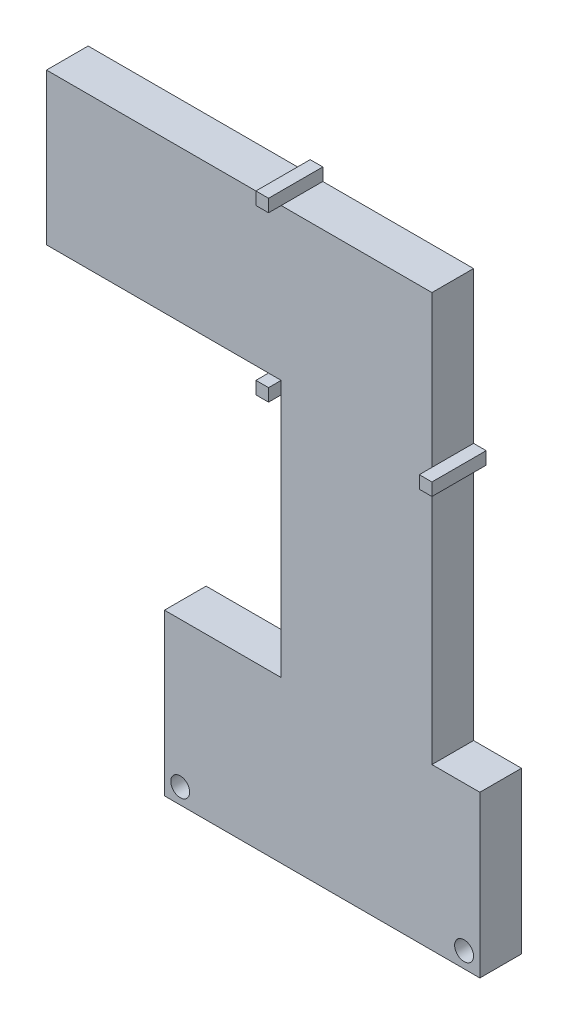
ISO-10303-21;
HEADER;
FILE_DESCRIPTION(('STEP AP214'),'2;1');
FILE_NAME('part.step','',(''),(''),'','','');
FILE_SCHEMA(('AUTOMOTIVE_DESIGN { 1 0 10303 214 1 1 1 1 }'));
ENDSEC;
DATA;
#1=APPLICATION_CONTEXT('core data for automotive mechanical design processes');
#2=APPLICATION_PROTOCOL_DEFINITION('international standard','automotive_design',2000,#1);
#3=PRODUCT_CONTEXT('',#1,'mechanical');
#4=PRODUCT('Part','Part','',(#3));
#5=PRODUCT_RELATED_PRODUCT_CATEGORY('part','',(#4));
#6=PRODUCT_DEFINITION_FORMATION('','',#4);
#7=PRODUCT_DEFINITION_CONTEXT('part definition',#1,'design');
#8=PRODUCT_DEFINITION('design','',#6,#7);
#9=PRODUCT_DEFINITION_SHAPE('','',#8);
#10=(LENGTH_UNIT() NAMED_UNIT(*) SI_UNIT(.MILLI.,.METRE.));
#11=(NAMED_UNIT(*) PLANE_ANGLE_UNIT() SI_UNIT($,.RADIAN.));
#12=(NAMED_UNIT(*) SI_UNIT($,.STERADIAN.) SOLID_ANGLE_UNIT());
#13=UNCERTAINTY_MEASURE_WITH_UNIT(LENGTH_MEASURE(1.E-05),#10,'distance_accuracy_value','');
#14=(GEOMETRIC_REPRESENTATION_CONTEXT(3) GLOBAL_UNCERTAINTY_ASSIGNED_CONTEXT((#13)) GLOBAL_UNIT_ASSIGNED_CONTEXT((#10,
#11,#12)) REPRESENTATION_CONTEXT('',''));
#15=CARTESIAN_POINT('',(0.,0.,0.));
#16=DIRECTION('',(0.,0.,1.));
#17=DIRECTION('',(1.,0.,0.));
#18=AXIS2_PLACEMENT_3D('',#15,#16,#17);
#19=CARTESIAN_POINT('',(0.,90.3000000000067,6.6));
#20=DIRECTION('',(0.,1.,0.));
#21=DIRECTION('',(-1.,0.,0.));
#22=AXIS2_PLACEMENT_3D('',#19,#20,#21);
#23=PLANE('',#22);
#24=DIRECTION('',(1.,0.,0.));
#25=VECTOR('',#24,1.);
#26=CARTESIAN_POINT('',(0.,90.3000000000067,6.6));
#27=LINE('',#26,#25);
#28=CARTESIAN_POINT('',(-68.7,90.3000000000067,6.6));
#29=VERTEX_POINT('',#28);
#30=CARTESIAN_POINT('',(-33.5,90.3000000000067,6.6));
#31=VERTEX_POINT('',#30);
#32=EDGE_CURVE('E349',#29,#31,#27,.T.);
#33=ORIENTED_EDGE('',*,*,#32,.T.);
#34=DIRECTION('',(0.,0.,-1.));
#35=VECTOR('',#34,1.);
#36=CARTESIAN_POINT('',(-33.5,90.3000000000067,9.4284271247462));
#37=LINE('',#36,#35);
#38=CARTESIAN_POINT('',(-33.5,90.3000000000067,0.));
#39=VERTEX_POINT('',#38);
#40=EDGE_CURVE('E284',#31,#39,#37,.T.);
#41=ORIENTED_EDGE('',*,*,#40,.T.);
#42=DIRECTION('',(1.,0.,0.));
#43=VECTOR('',#42,1.);
#44=CARTESIAN_POINT('',(0.,90.3000000000067,0.));
#45=LINE('',#44,#43);
#46=CARTESIAN_POINT('',(-68.7,90.3000000000067,0.));
#47=VERTEX_POINT('',#46);
#48=EDGE_CURVE('E381',#47,#39,#45,.T.);
#49=ORIENTED_EDGE('',*,*,#48,.F.);
#50=DIRECTION('',(0.,0.,-1.));
#51=VECTOR('',#50,1.);
#52=CARTESIAN_POINT('',(-68.7,90.3000000000067,6.6));
#53=LINE('',#52,#51);
#54=EDGE_CURVE('E399',#29,#47,#53,.T.);
#55=ORIENTED_EDGE('',*,*,#54,.F.);
#56=EDGE_LOOP('',(#33,#41,#49,#55));
#57=FACE_BOUND('',#56,.T.);
#58=ADVANCED_FACE('F41',(#57),#23,.T.);
#59=CARTESIAN_POINT('',(-7.59999999999999,0.,6.6));
#60=DIRECTION('',(1.,0.,0.));
#61=DIRECTION('',(0.,1.,0.));
#62=AXIS2_PLACEMENT_3D('',#59,#60,#61);
#63=PLANE('',#62);
#64=DIRECTION('',(0.,-1.,0.));
#65=VECTOR('',#64,1.);
#66=CARTESIAN_POINT('',(-7.59999999999999,0.,0.));
#67=LINE('',#66,#65);
#68=CARTESIAN_POINT('',(-7.6,64.3000000000204,0.));
#69=VERTEX_POINT('',#68);
#70=CARTESIAN_POINT('',(-7.6,25.5,0.));
#71=VERTEX_POINT('',#70);
#72=EDGE_CURVE('E376',#69,#71,#67,.T.);
#73=ORIENTED_EDGE('',*,*,#72,.F.);
#74=DIRECTION('',(0.,0.,-1.));
#75=VECTOR('',#74,1.);
#76=CARTESIAN_POINT('',(-7.6,64.3000000000204,9.4284271247462));
#77=LINE('',#76,#75);
#78=CARTESIAN_POINT('',(-7.6,64.3000000000204,6.6));
#79=VERTEX_POINT('',#78);
#80=EDGE_CURVE('E300',#79,#69,#77,.T.);
#81=ORIENTED_EDGE('',*,*,#80,.F.);
#82=DIRECTION('',(0.,-1.,0.));
#83=VECTOR('',#82,1.);
#84=CARTESIAN_POINT('',(-7.59999999999999,0.,6.6));
#85=LINE('',#84,#83);
#86=CARTESIAN_POINT('',(-7.6,25.5,6.6));
#87=VERTEX_POINT('',#86);
#88=EDGE_CURVE('E343',#79,#87,#85,.T.);
#89=ORIENTED_EDGE('',*,*,#88,.T.);
#90=DIRECTION('',(0.,0.,-1.));
#91=VECTOR('',#90,1.);
#92=CARTESIAN_POINT('',(-7.6,25.5,6.6));
#93=LINE('',#92,#91);
#94=EDGE_CURVE('E404',#87,#71,#93,.T.);
#95=ORIENTED_EDGE('',*,*,#94,.T.);
#96=EDGE_LOOP('',(#73,#81,#89,#95));
#97=FACE_BOUND('',#96,.T.);
#98=ADVANCED_FACE('F483',(#97),#63,.T.);
#99=CARTESIAN_POINT('',(-7.6,90.3000000000067,6.6));
#100=VERTEX_POINT('',#99);
#101=CARTESIAN_POINT('',(-7.6,66.3000000000204,6.6));
#102=VERTEX_POINT('',#101);
#103=EDGE_CURVE('E345',#100,#102,#85,.T.);
#104=ORIENTED_EDGE('',*,*,#103,.T.);
#105=DIRECTION('',(0.,0.,-1.));
#106=VECTOR('',#105,1.);
#107=CARTESIAN_POINT('',(-7.6,66.3000000000204,9.4284271247462));
#108=LINE('',#107,#106);
#109=CARTESIAN_POINT('',(-7.6,66.3000000000204,0.));
#110=VERTEX_POINT('',#109);
#111=EDGE_CURVE('E297',#102,#110,#108,.T.);
#112=ORIENTED_EDGE('',*,*,#111,.T.);
#113=CARTESIAN_POINT('',(-7.6,90.3000000000067,0.));
#114=VERTEX_POINT('',#113);
#115=EDGE_CURVE('E377',#114,#110,#67,.T.);
#116=ORIENTED_EDGE('',*,*,#115,.F.);
#117=DIRECTION('',(0.,0.,-1.));
#118=VECTOR('',#117,1.);
#119=CARTESIAN_POINT('',(-7.6,90.3000000000067,6.6));
#120=LINE('',#119,#118);
#121=EDGE_CURVE('E401',#100,#114,#120,.T.);
#122=ORIENTED_EDGE('',*,*,#121,.F.);
#123=EDGE_LOOP('',(#104,#112,#116,#122));
#124=FACE_BOUND('',#123,.T.);
#125=ADVANCED_FACE('F467',(#124),#63,.T.);
#126=CARTESIAN_POINT('',(0.,66.3000000000204,6.6));
#127=DIRECTION('',(0.,-1.,0.));
#128=DIRECTION('',(1.,0.,0.));
#129=AXIS2_PLACEMENT_3D('',#126,#127,#128);
#130=PLANE('',#129);
#131=DIRECTION('',(-1.,0.,0.));
#132=VECTOR('',#131,1.);
#133=CARTESIAN_POINT('',(0.,66.3000000000204,0.));
#134=LINE('',#133,#132);
#135=CARTESIAN_POINT('',(-33.5,66.3000000000204,0.));
#136=VERTEX_POINT('',#135);
#137=CARTESIAN_POINT('',(-68.7,66.3000000000204,0.));
#138=VERTEX_POINT('',#137);
#139=EDGE_CURVE('E387',#136,#138,#134,.T.);
#140=ORIENTED_EDGE('',*,*,#139,.F.);
#141=DIRECTION('',(0.,0.,-1.));
#142=VECTOR('',#141,1.);
#143=CARTESIAN_POINT('',(-33.5,66.3000000000204,9.4284271247462));
#144=LINE('',#143,#142);
#145=CARTESIAN_POINT('',(-33.5,66.3000000000204,6.6));
#146=VERTEX_POINT('',#145);
#147=EDGE_CURVE('E318',#146,#136,#144,.T.);
#148=ORIENTED_EDGE('',*,*,#147,.F.);
#149=DIRECTION('',(-1.,0.,0.));
#150=VECTOR('',#149,1.);
#151=CARTESIAN_POINT('',(0.,66.3000000000204,6.6));
#152=LINE('',#151,#150);
#153=CARTESIAN_POINT('',(-68.7,66.3000000000204,6.6));
#154=VERTEX_POINT('',#153);
#155=EDGE_CURVE('E354',#146,#154,#152,.T.);
#156=ORIENTED_EDGE('',*,*,#155,.T.);
#157=DIRECTION('',(0.,0.,-1.));
#158=VECTOR('',#157,1.);
#159=CARTESIAN_POINT('',(-68.7,66.3000000000204,6.6));
#160=LINE('',#159,#158);
#161=EDGE_CURVE('E396',#154,#138,#160,.T.);
#162=ORIENTED_EDGE('',*,*,#161,.T.);
#163=EDGE_LOOP('',(#140,#148,#156,#162));
#164=FACE_BOUND('',#163,.T.);
#165=ADVANCED_FACE('F446',(#164),#130,.T.);
#166=CARTESIAN_POINT('',(-31.5,0.,6.6));
#167=DIRECTION('',(-1.,0.,0.));
#168=DIRECTION('',(0.,0.,1.));
#169=AXIS2_PLACEMENT_3D('',#166,#167,#168);
#170=PLANE('',#169);
#171=DIRECTION('',(0.,1.,0.));
#172=VECTOR('',#171,1.);
#173=CARTESIAN_POINT('',(-31.5,0.,6.6));
#174=LINE('',#173,#172);
#175=CARTESIAN_POINT('',(-31.5,25.5,6.6));
#176=VERTEX_POINT('',#175);
#177=CARTESIAN_POINT('',(-31.5,64.3000000000204,6.6));
#178=VERTEX_POINT('',#177);
#179=EDGE_CURVE('E356',#176,#178,#174,.T.);
#180=ORIENTED_EDGE('',*,*,#179,.T.);
#181=DIRECTION('',(0.,0.,-1.));
#182=VECTOR('',#181,1.);
#183=CARTESIAN_POINT('',(-31.5,64.3000000000204,9.4284271247462));
#184=LINE('',#183,#182);
#185=CARTESIAN_POINT('',(-31.5,64.3000000000204,0.));
#186=VERTEX_POINT('',#185);
#187=EDGE_CURVE('E285',#178,#186,#184,.T.);
#188=ORIENTED_EDGE('',*,*,#187,.T.);
#189=DIRECTION('',(0.,1.,0.));
#190=VECTOR('',#189,1.);
#191=CARTESIAN_POINT('',(-31.5,0.,0.));
#192=LINE('',#191,#190);
#193=CARTESIAN_POINT('',(-31.5,25.5,0.));
#194=VERTEX_POINT('',#193);
#195=EDGE_CURVE('E389',#194,#186,#192,.T.);
#196=ORIENTED_EDGE('',*,*,#195,.F.);
#197=DIRECTION('',(0.,0.,-1.));
#198=VECTOR('',#197,1.);
#199=CARTESIAN_POINT('',(-31.5,25.5,6.6));
#200=LINE('',#199,#198);
#201=EDGE_CURVE('E394',#176,#194,#200,.T.);
#202=ORIENTED_EDGE('',*,*,#201,.F.);
#203=EDGE_LOOP('',(#180,#188,#196,#202));
#204=FACE_BOUND('',#203,.T.);
#205=ADVANCED_FACE('F430',(#204),#170,.T.);
#206=CARTESIAN_POINT('',(-50.,0.,6.6));
#207=DIRECTION('',(-1.,0.,0.));
#208=DIRECTION('',(0.,0.,1.));
#209=AXIS2_PLACEMENT_3D('',#206,#207,#208);
#210=PLANE('',#209);
#211=DIRECTION('',(0.,1.,0.));
#212=VECTOR('',#211,1.);
#213=CARTESIAN_POINT('',(-50.,0.,0.));
#214=LINE('',#213,#212);
#215=CARTESIAN_POINT('',(-50.,0.,0.));
#216=VERTEX_POINT('',#215);
#217=CARTESIAN_POINT('',(-50.,25.5,0.));
#218=VERTEX_POINT('',#217);
#219=EDGE_CURVE('E364',#216,#218,#214,.T.);
#220=ORIENTED_EDGE('',*,*,#219,.F.);
#221=DIRECTION('',(0.,0.,-1.));
#222=VECTOR('',#221,1.);
#223=CARTESIAN_POINT('',(-50.,0.,6.6));
#224=LINE('',#223,#222);
#225=CARTESIAN_POINT('',(-50.,0.,6.6));
#226=VERTEX_POINT('',#225);
#227=EDGE_CURVE('E11',#226,#216,#224,.T.);
#228=ORIENTED_EDGE('',*,*,#227,.F.);
#229=DIRECTION('',(0.,1.,0.));
#230=VECTOR('',#229,1.);
#231=CARTESIAN_POINT('',(-50.,0.,6.6));
#232=LINE('',#231,#230);
#233=CARTESIAN_POINT('',(-50.,25.5,6.6));
#234=VERTEX_POINT('',#233);
#235=EDGE_CURVE('E331',#226,#234,#232,.T.);
#236=ORIENTED_EDGE('',*,*,#235,.T.);
#237=DIRECTION('',(0.,0.,-1.));
#238=VECTOR('',#237,1.);
#239=CARTESIAN_POINT('',(-50.,25.5,6.6));
#240=LINE('',#239,#238);
#241=EDGE_CURVE('E392',#234,#218,#240,.T.);
#242=ORIENTED_EDGE('',*,*,#241,.T.);
#243=EDGE_LOOP('',(#220,#228,#236,#242));
#244=FACE_BOUND('',#243,.T.);
#245=ADVANCED_FACE('F422',(#244),#210,.T.);
#246=CARTESIAN_POINT('',(0.,0.,6.6));
#247=DIRECTION('',(0.,-1.,0.));
#248=DIRECTION('',(0.,0.,-1.));
#249=AXIS2_PLACEMENT_3D('',#246,#247,#248);
#250=PLANE('',#249);
#251=DIRECTION('',(-1.,0.,0.));
#252=VECTOR('',#251,1.);
#253=CARTESIAN_POINT('',(0.,0.,0.));
#254=LINE('',#253,#252);
#255=CARTESIAN_POINT('',(0.,0.,0.));
#256=VERTEX_POINT('',#255);
#257=EDGE_CURVE('E367',#256,#216,#254,.T.);
#258=ORIENTED_EDGE('',*,*,#257,.F.);
#259=DIRECTION('',(0.,0.,-1.));
#260=VECTOR('',#259,1.);
#261=CARTESIAN_POINT('',(0.,0.,6.6));
#262=LINE('',#261,#260);
#263=CARTESIAN_POINT('',(0.,0.,6.6));
#264=VERTEX_POINT('',#263);
#265=EDGE_CURVE('E49',#264,#256,#262,.T.);
#266=ORIENTED_EDGE('',*,*,#265,.F.);
#267=DIRECTION('',(-1.,0.,0.));
#268=VECTOR('',#267,1.);
#269=CARTESIAN_POINT('',(0.,0.,6.6));
#270=LINE('',#269,#268);
#271=EDGE_CURVE('E334',#264,#226,#270,.T.);
#272=ORIENTED_EDGE('',*,*,#271,.T.);
#273=ORIENTED_EDGE('',*,*,#227,.T.);
#274=EDGE_LOOP('',(#258,#266,#272,#273));
#275=FACE_BOUND('',#274,.T.);
#276=ADVANCED_FACE('F418',(#275),#250,.T.);
#277=CARTESIAN_POINT('',(0.,0.,6.6));
#278=DIRECTION('',(-1.,0.,0.));
#279=DIRECTION('',(0.,0.,1.));
#280=AXIS2_PLACEMENT_3D('',#277,#278,#279);
#281=PLANE('',#280);
#282=DIRECTION('',(0.,1.,0.));
#283=VECTOR('',#282,1.);
#284=CARTESIAN_POINT('',(0.,0.,0.));
#285=LINE('',#284,#283);
#286=CARTESIAN_POINT('',(0.,25.5,0.));
#287=VERTEX_POINT('',#286);
#288=EDGE_CURVE('E370',#256,#287,#285,.T.);
#289=ORIENTED_EDGE('',*,*,#288,.T.);
#290=DIRECTION('',(0.,0.,-1.));
#291=VECTOR('',#290,1.);
#292=CARTESIAN_POINT('',(0.,25.5,6.6));
#293=LINE('',#292,#291);
#294=CARTESIAN_POINT('',(0.,25.5,6.6));
#295=VERTEX_POINT('',#294);
#296=EDGE_CURVE('E407',#295,#287,#293,.T.);
#297=ORIENTED_EDGE('',*,*,#296,.F.);
#298=DIRECTION('',(0.,1.,0.));
#299=VECTOR('',#298,1.);
#300=CARTESIAN_POINT('',(0.,0.,6.6));
#301=LINE('',#300,#299);
#302=EDGE_CURVE('E337',#264,#295,#301,.T.);
#303=ORIENTED_EDGE('',*,*,#302,.F.);
#304=ORIENTED_EDGE('',*,*,#265,.T.);
#305=EDGE_LOOP('',(#289,#297,#303,#304));
#306=FACE_BOUND('',#305,.T.);
#307=ADVANCED_FACE('F412',(#306),#281,.F.);
#308=CARTESIAN_POINT('',(0.,25.5,6.6));
#309=DIRECTION('',(0.,-1.,0.));
#310=DIRECTION('',(0.,0.,-1.));
#311=AXIS2_PLACEMENT_3D('',#308,#309,#310);
#312=PLANE('',#311);
#313=DIRECTION('',(-1.,0.,0.));
#314=VECTOR('',#313,1.);
#315=CARTESIAN_POINT('',(0.,25.5,0.));
#316=LINE('',#315,#314);
#317=EDGE_CURVE('E373',#287,#71,#316,.T.);
#318=ORIENTED_EDGE('',*,*,#317,.T.);
#319=ORIENTED_EDGE('',*,*,#94,.F.);
#320=DIRECTION('',(-1.,0.,0.));
#321=VECTOR('',#320,1.);
#322=CARTESIAN_POINT('',(0.,25.5,6.6));
#323=LINE('',#322,#321);
#324=EDGE_CURVE('E340',#295,#87,#323,.T.);
#325=ORIENTED_EDGE('',*,*,#324,.F.);
#326=ORIENTED_EDGE('',*,*,#296,.T.);
#327=EDGE_LOOP('',(#318,#319,#325,#326));
#328=FACE_BOUND('',#327,.T.);
#329=ADVANCED_FACE('F486',(#328),#312,.F.);
#330=DIRECTION('',(0.,0.,-1.));
#331=VECTOR('',#330,1.);
#332=CARTESIAN_POINT('',(-31.5,90.3000000000067,9.4284271247462));
#333=LINE('',#332,#331);
#334=CARTESIAN_POINT('',(-31.5,90.3000000000067,6.6));
#335=VERTEX_POINT('',#334);
#336=CARTESIAN_POINT('',(-31.5,90.3000000000067,0.));
#337=VERTEX_POINT('',#336);
#338=EDGE_CURVE('E286',#335,#337,#333,.T.);
#339=ORIENTED_EDGE('',*,*,#338,.F.);
#340=EDGE_CURVE('E348',#335,#100,#27,.T.);
#341=ORIENTED_EDGE('',*,*,#340,.T.);
#342=ORIENTED_EDGE('',*,*,#121,.T.);
#343=EDGE_CURVE('E380',#337,#114,#45,.T.);
#344=ORIENTED_EDGE('',*,*,#343,.F.);
#345=EDGE_LOOP('',(#339,#341,#342,#344));
#346=FACE_BOUND('',#345,.T.);
#347=ADVANCED_FACE('F464',(#346),#23,.T.);
#348=CARTESIAN_POINT('',(-68.7,0.,6.6));
#349=DIRECTION('',(1.,0.,0.));
#350=DIRECTION('',(0.,0.,-1.));
#351=AXIS2_PLACEMENT_3D('',#348,#349,#350);
#352=PLANE('',#351);
#353=DIRECTION('',(0.,-1.,0.));
#354=VECTOR('',#353,1.);
#355=CARTESIAN_POINT('',(-68.7,0.,0.));
#356=LINE('',#355,#354);
#357=EDGE_CURVE('E384',#47,#138,#356,.T.);
#358=ORIENTED_EDGE('',*,*,#357,.T.);
#359=ORIENTED_EDGE('',*,*,#161,.F.);
#360=DIRECTION('',(0.,-1.,0.));
#361=VECTOR('',#360,1.);
#362=CARTESIAN_POINT('',(-68.7,0.,6.6));
#363=LINE('',#362,#361);
#364=EDGE_CURVE('E351',#29,#154,#363,.T.);
#365=ORIENTED_EDGE('',*,*,#364,.F.);
#366=ORIENTED_EDGE('',*,*,#54,.T.);
#367=EDGE_LOOP('',(#358,#359,#365,#366));
#368=FACE_BOUND('',#367,.T.);
#369=ADVANCED_FACE('F450',(#368),#352,.F.);
#370=CARTESIAN_POINT('',(-47.5,2.50000000000003,6.6));
#371=DIRECTION('',(0.,0.,-1.));
#372=DIRECTION('',(-1.,0.,0.));
#373=AXIS2_PLACEMENT_3D('',#370,#371,#372);
#374=CYLINDRICAL_SURFACE('',#373,1.5);
#375=CARTESIAN_POINT('',(-47.5,2.50000000000003,6.6));
#376=DIRECTION('',(0.,0.,1.));
#377=DIRECTION('',(1.,0.,0.));
#378=AXIS2_PLACEMENT_3D('',#375,#376,#377);
#379=CIRCLE('',#378,1.5);
#380=CARTESIAN_POINT('',(-46.,2.50000000000003,6.6));
#381=VERTEX_POINT('',#380);
#382=EDGE_CURVE('E327',#381,#381,#379,.T.);
#383=ORIENTED_EDGE('',*,*,#382,.T.);
#384=EDGE_LOOP('',(#383));
#385=FACE_BOUND('',#384,.T.);
#386=CARTESIAN_POINT('',(-47.5,2.50000000000003,0.));
#387=DIRECTION('',(0.,0.,1.));
#388=DIRECTION('',(1.,0.,0.));
#389=AXIS2_PLACEMENT_3D('',#386,#387,#388);
#390=CIRCLE('',#389,1.5);
#391=CARTESIAN_POINT('',(-46.,2.50000000000003,0.));
#392=VERTEX_POINT('',#391);
#393=EDGE_CURVE('E361',#392,#392,#390,.T.);
#394=ORIENTED_EDGE('',*,*,#393,.F.);
#395=EDGE_LOOP('',(#394));
#396=FACE_BOUND('',#395,.T.);
#397=ADVANCED_FACE('F498',(#385,#396),#374,.F.);
#398=CARTESIAN_POINT('',(-2.50000000000006,2.50000000000003,6.6));
#399=DIRECTION('',(0.,0.,-1.));
#400=DIRECTION('',(-1.,0.,0.));
#401=AXIS2_PLACEMENT_3D('',#398,#399,#400);
#402=CYLINDRICAL_SURFACE('',#401,1.5);
#403=CARTESIAN_POINT('',(-2.50000000000006,2.50000000000003,6.6));
#404=DIRECTION('',(0.,0.,1.));
#405=DIRECTION('',(1.,0.,0.));
#406=AXIS2_PLACEMENT_3D('',#403,#404,#405);
#407=CIRCLE('',#406,1.5);
#408=CARTESIAN_POINT('',(-1.00000000000006,2.50000000000003,6.6));
#409=VERTEX_POINT('',#408);
#410=EDGE_CURVE('E324',#409,#409,#407,.T.);
#411=ORIENTED_EDGE('',*,*,#410,.T.);
#412=EDGE_LOOP('',(#411));
#413=FACE_BOUND('',#412,.T.);
#414=CARTESIAN_POINT('',(-2.50000000000006,2.50000000000003,0.));
#415=DIRECTION('',(0.,0.,1.));
#416=DIRECTION('',(1.,0.,0.));
#417=AXIS2_PLACEMENT_3D('',#414,#415,#416);
#418=CIRCLE('',#417,1.5);
#419=CARTESIAN_POINT('',(-1.00000000000006,2.50000000000003,0.));
#420=VERTEX_POINT('',#419);
#421=EDGE_CURVE('E313',#420,#420,#418,.T.);
#422=ORIENTED_EDGE('',*,*,#421,.F.);
#423=EDGE_LOOP('',(#422));
#424=FACE_BOUND('',#423,.T.);
#425=ADVANCED_FACE('F43',(#413,#424),#402,.F.);
#426=EDGE_CURVE('E328',#194,#218,#316,.T.);
#427=ORIENTED_EDGE('',*,*,#426,.T.);
#428=ORIENTED_EDGE('',*,*,#241,.F.);
#429=EDGE_CURVE('E344',#176,#234,#323,.T.);
#430=ORIENTED_EDGE('',*,*,#429,.F.);
#431=ORIENTED_EDGE('',*,*,#201,.T.);
#432=EDGE_LOOP('',(#427,#428,#430,#431));
#433=FACE_BOUND('',#432,.T.);
#434=ADVANCED_FACE('F489',(#433),#312,.F.);
#435=CARTESIAN_POINT('',(0.,0.,6.6));
#436=DIRECTION('',(0.,0.,1.));
#437=DIRECTION('',(1.,0.,0.));
#438=AXIS2_PLACEMENT_3D('',#435,#436,#437);
#439=PLANE('',#438);
#440=DIRECTION('',(1.,0.,0.));
#441=VECTOR('',#440,1.);
#442=CARTESIAN_POINT('',(-33.5,90.3000000000067,6.6));
#443=LINE('',#442,#441);
#444=EDGE_CURVE('E56',#31,#335,#443,.T.);
#445=ORIENTED_EDGE('',*,*,#444,.F.);
#446=ORIENTED_EDGE('',*,*,#32,.F.);
#447=ORIENTED_EDGE('',*,*,#364,.T.);
#448=ORIENTED_EDGE('',*,*,#155,.F.);
#449=DIRECTION('',(-1.,0.,0.));
#450=VECTOR('',#449,1.);
#451=CARTESIAN_POINT('',(-31.5,66.3000000000204,6.6));
#452=LINE('',#451,#450);
#453=CARTESIAN_POINT('',(-31.5,66.3000000000204,6.6));
#454=VERTEX_POINT('',#453);
#455=EDGE_CURVE('E230',#454,#146,#452,.T.);
#456=ORIENTED_EDGE('',*,*,#455,.F.);
#457=DIRECTION('',(0.,1.,0.));
#458=VECTOR('',#457,1.);
#459=CARTESIAN_POINT('',(-31.5,64.3000000000204,6.6));
#460=LINE('',#459,#458);
#461=EDGE_CURVE('E251',#178,#454,#460,.T.);
#462=ORIENTED_EDGE('',*,*,#461,.F.);
#463=ORIENTED_EDGE('',*,*,#179,.F.);
#464=ORIENTED_EDGE('',*,*,#429,.T.);
#465=ORIENTED_EDGE('',*,*,#235,.F.);
#466=ORIENTED_EDGE('',*,*,#271,.F.);
#467=ORIENTED_EDGE('',*,*,#302,.T.);
#468=ORIENTED_EDGE('',*,*,#324,.T.);
#469=ORIENTED_EDGE('',*,*,#88,.F.);
#470=DIRECTION('',(0.,-1.,0.));
#471=VECTOR('',#470,1.);
#472=CARTESIAN_POINT('',(-7.6,64.3000000000204,6.6));
#473=LINE('',#472,#471);
#474=EDGE_CURVE('E244',#102,#79,#473,.T.);
#475=ORIENTED_EDGE('',*,*,#474,.F.);
#476=ORIENTED_EDGE('',*,*,#103,.F.);
#477=ORIENTED_EDGE('',*,*,#340,.F.);
#478=EDGE_LOOP('',(#445,#446,#447,#448,#456,#462,#463,#464,#465,#466,#467,#468,#469,#475,#476,#477));
#479=FACE_BOUND('',#478,.T.);
#480=ORIENTED_EDGE('',*,*,#410,.F.);
#481=EDGE_LOOP('',(#480));
#482=FACE_BOUND('',#481,.T.);
#483=ORIENTED_EDGE('',*,*,#382,.F.);
#484=EDGE_LOOP('',(#483));
#485=FACE_BOUND('',#484,.T.);
#486=ADVANCED_FACE('F487',(#479,#482,#485),#439,.T.);
#487=CARTESIAN_POINT('',(0.,0.,0.));
#488=DIRECTION('',(0.,0.,1.));
#489=DIRECTION('',(1.,0.,0.));
#490=AXIS2_PLACEMENT_3D('',#487,#488,#489);
#491=PLANE('',#490);
#492=ORIENTED_EDGE('',*,*,#421,.T.);
#493=EDGE_LOOP('',(#492));
#494=FACE_BOUND('',#493,.T.);
#495=ORIENTED_EDGE('',*,*,#393,.T.);
#496=EDGE_LOOP('',(#495));
#497=FACE_BOUND('',#496,.T.);
#498=ORIENTED_EDGE('',*,*,#219,.T.);
#499=ORIENTED_EDGE('',*,*,#426,.F.);
#500=ORIENTED_EDGE('',*,*,#195,.T.);
#501=DIRECTION('',(1.,0.,0.));
#502=VECTOR('',#501,1.);
#503=CARTESIAN_POINT('',(-33.5,64.3000000000204,0.));
#504=LINE('',#503,#502);
#505=CARTESIAN_POINT('',(-33.5,64.3000000000204,0.));
#506=VERTEX_POINT('',#505);
#507=EDGE_CURVE('E311',#506,#186,#504,.T.);
#508=ORIENTED_EDGE('',*,*,#507,.F.);
#509=DIRECTION('',(0.,-1.,0.));
#510=VECTOR('',#509,1.);
#511=CARTESIAN_POINT('',(-33.5,66.3000000000204,0.));
#512=LINE('',#511,#510);
#513=EDGE_CURVE('E315',#136,#506,#512,.T.);
#514=ORIENTED_EDGE('',*,*,#513,.F.);
#515=ORIENTED_EDGE('',*,*,#139,.T.);
#516=ORIENTED_EDGE('',*,*,#357,.F.);
#517=ORIENTED_EDGE('',*,*,#48,.T.);
#518=DIRECTION('',(0.,-1.,0.));
#519=VECTOR('',#518,1.);
#520=CARTESIAN_POINT('',(-33.5,90.3000000000067,0.));
#521=LINE('',#520,#519);
#522=CARTESIAN_POINT('',(-33.5,92.3000000000067,0.));
#523=VERTEX_POINT('',#522);
#524=EDGE_CURVE('E213',#523,#39,#521,.T.);
#525=ORIENTED_EDGE('',*,*,#524,.F.);
#526=DIRECTION('',(-1.,0.,0.));
#527=VECTOR('',#526,1.);
#528=CARTESIAN_POINT('',(-33.5,92.3000000000067,0.));
#529=LINE('',#528,#527);
#530=CARTESIAN_POINT('',(-31.5,92.3000000000067,0.));
#531=VERTEX_POINT('',#530);
#532=EDGE_CURVE('E209',#531,#523,#529,.T.);
#533=ORIENTED_EDGE('',*,*,#532,.F.);
#534=DIRECTION('',(0.,1.,0.));
#535=VECTOR('',#534,1.);
#536=CARTESIAN_POINT('',(-31.5,92.3000000000067,0.));
#537=LINE('',#536,#535);
#538=EDGE_CURVE('E290',#337,#531,#537,.T.);
#539=ORIENTED_EDGE('',*,*,#538,.F.);
#540=ORIENTED_EDGE('',*,*,#343,.T.);
#541=ORIENTED_EDGE('',*,*,#115,.T.);
#542=DIRECTION('',(-1.,0.,0.));
#543=VECTOR('',#542,1.);
#544=CARTESIAN_POINT('',(-5.6,66.3000000000204,0.));
#545=LINE('',#544,#543);
#546=CARTESIAN_POINT('',(-5.6,66.3000000000204,0.));
#547=VERTEX_POINT('',#546);
#548=EDGE_CURVE('E239',#547,#110,#545,.T.);
#549=ORIENTED_EDGE('',*,*,#548,.F.);
#550=DIRECTION('',(0.,1.,0.));
#551=VECTOR('',#550,1.);
#552=CARTESIAN_POINT('',(-5.6,64.3000000000204,0.));
#553=LINE('',#552,#551);
#554=CARTESIAN_POINT('',(-5.6,64.3000000000204,0.));
#555=VERTEX_POINT('',#554);
#556=EDGE_CURVE('E303',#555,#547,#553,.T.);
#557=ORIENTED_EDGE('',*,*,#556,.F.);
#558=DIRECTION('',(1.,0.,0.));
#559=VECTOR('',#558,1.);
#560=CARTESIAN_POINT('',(-7.6,64.3000000000204,0.));
#561=LINE('',#560,#559);
#562=EDGE_CURVE('E64',#69,#555,#561,.T.);
#563=ORIENTED_EDGE('',*,*,#562,.F.);
#564=ORIENTED_EDGE('',*,*,#72,.T.);
#565=ORIENTED_EDGE('',*,*,#317,.F.);
#566=ORIENTED_EDGE('',*,*,#288,.F.);
#567=ORIENTED_EDGE('',*,*,#257,.T.);
#568=EDGE_LOOP('',(#498,#499,#500,#508,#514,#515,#516,#517,#525,#533,#539,#540,#541,#549,#557,
#563,#564,#565,#566,#567));
#569=FACE_BOUND('',#568,.T.);
#570=ADVANCED_FACE('F417',(#494,#497,#569),#491,.F.);
#571=CARTESIAN_POINT('',(-33.5,66.3000000000204,9.4284271247462));
#572=DIRECTION('',(1.,0.,0.));
#573=DIRECTION('',(0.,0.,-1.));
#574=AXIS2_PLACEMENT_3D('',#571,#572,#573);
#575=PLANE('',#574);
#576=DIRECTION('',(0.,0.,-1.));
#577=VECTOR('',#576,1.);
#578=CARTESIAN_POINT('',(-33.5,64.3000000000204,9.4284271247462));
#579=LINE('',#578,#577);
#580=CARTESIAN_POINT('',(-33.5,64.3000000000204,8.6));
#581=VERTEX_POINT('',#580);
#582=EDGE_CURVE('E314',#581,#506,#579,.T.);
#583=ORIENTED_EDGE('',*,*,#582,.F.);
#584=DIRECTION('',(0.,-1.,0.));
#585=VECTOR('',#584,1.);
#586=CARTESIAN_POINT('',(-33.5,66.3000000000204,8.6));
#587=LINE('',#586,#585);
#588=CARTESIAN_POINT('',(-33.5,66.3000000000204,8.6));
#589=VERTEX_POINT('',#588);
#590=EDGE_CURVE('E260',#589,#581,#587,.T.);
#591=ORIENTED_EDGE('',*,*,#590,.F.);
#592=DIRECTION('',(0.,0.,-1.));
#593=VECTOR('',#592,1.);
#594=CARTESIAN_POINT('',(-33.5,66.3000000000204,8.6));
#595=LINE('',#594,#593);
#596=EDGE_CURVE('E240',#589,#146,#595,.T.);
#597=ORIENTED_EDGE('',*,*,#596,.T.);
#598=ORIENTED_EDGE('',*,*,#147,.T.);
#599=ORIENTED_EDGE('',*,*,#513,.T.);
#600=EDGE_LOOP('',(#583,#591,#597,#598,#599));
#601=FACE_BOUND('',#600,.T.);
#602=ADVANCED_FACE('F442',(#601),#575,.F.);
#603=CARTESIAN_POINT('',(-33.5,64.3000000000204,9.4284271247462));
#604=DIRECTION('',(0.,1.,0.));
#605=DIRECTION('',(0.,0.,1.));
#606=AXIS2_PLACEMENT_3D('',#603,#604,#605);
#607=PLANE('',#606);
#608=ORIENTED_EDGE('',*,*,#187,.F.);
#609=DIRECTION('',(0.,0.,-1.));
#610=VECTOR('',#609,1.);
#611=CARTESIAN_POINT('',(-31.5,64.3000000000204,8.6));
#612=LINE('',#611,#610);
#613=CARTESIAN_POINT('',(-31.5,64.3000000000204,8.6));
#614=VERTEX_POINT('',#613);
#615=EDGE_CURVE('E243',#614,#178,#612,.T.);
#616=ORIENTED_EDGE('',*,*,#615,.F.);
#617=DIRECTION('',(1.,0.,0.));
#618=VECTOR('',#617,1.);
#619=CARTESIAN_POINT('',(-33.5,64.3000000000204,8.6));
#620=LINE('',#619,#618);
#621=EDGE_CURVE('E258',#581,#614,#620,.T.);
#622=ORIENTED_EDGE('',*,*,#621,.F.);
#623=ORIENTED_EDGE('',*,*,#582,.T.);
#624=ORIENTED_EDGE('',*,*,#507,.T.);
#625=EDGE_LOOP('',(#608,#616,#622,#623,#624));
#626=FACE_BOUND('',#625,.T.);
#627=ADVANCED_FACE('F436',(#626),#607,.F.);
#628=CARTESIAN_POINT('',(-7.6,64.3000000000204,9.4284271247462));
#629=DIRECTION('',(0.,1.,0.));
#630=DIRECTION('',(0.,0.,1.));
#631=AXIS2_PLACEMENT_3D('',#628,#629,#630);
#632=PLANE('',#631);
#633=DIRECTION('',(0.,0.,-1.));
#634=VECTOR('',#633,1.);
#635=CARTESIAN_POINT('',(-5.6,64.3000000000204,9.4284271247462));
#636=LINE('',#635,#634);
#637=CARTESIAN_POINT('',(-5.6,64.3000000000204,8.6));
#638=VERTEX_POINT('',#637);
#639=EDGE_CURVE('E304',#638,#555,#636,.T.);
#640=ORIENTED_EDGE('',*,*,#639,.F.);
#641=DIRECTION('',(1.,0.,0.));
#642=VECTOR('',#641,1.);
#643=CARTESIAN_POINT('',(-5.6,64.3000000000204,8.6));
#644=LINE('',#643,#642);
#645=CARTESIAN_POINT('',(-7.6,64.3000000000204,8.6));
#646=VERTEX_POINT('',#645);
#647=EDGE_CURVE('E277',#646,#638,#644,.T.);
#648=ORIENTED_EDGE('',*,*,#647,.F.);
#649=DIRECTION('',(0.,0.,-1.));
#650=VECTOR('',#649,1.);
#651=CARTESIAN_POINT('',(-7.6,64.3000000000204,8.6));
#652=LINE('',#651,#650);
#653=EDGE_CURVE('E268',#646,#79,#652,.T.);
#654=ORIENTED_EDGE('',*,*,#653,.T.);
#655=ORIENTED_EDGE('',*,*,#80,.T.);
#656=ORIENTED_EDGE('',*,*,#562,.T.);
#657=EDGE_LOOP('',(#640,#648,#654,#655,#656));
#658=FACE_BOUND('',#657,.T.);
#659=ADVANCED_FACE('F478',(#658),#632,.F.);
#660=CARTESIAN_POINT('',(-5.6,64.3000000000204,9.4284271247462));
#661=DIRECTION('',(-1.,0.,0.));
#662=DIRECTION('',(0.,0.,1.));
#663=AXIS2_PLACEMENT_3D('',#660,#661,#662);
#664=PLANE('',#663);
#665=DIRECTION('',(0.,0.,-1.));
#666=VECTOR('',#665,1.);
#667=CARTESIAN_POINT('',(-5.6,66.3000000000204,9.4284271247462));
#668=LINE('',#667,#666);
#669=CARTESIAN_POINT('',(-5.6,66.3000000000204,8.6));
#670=VERTEX_POINT('',#669);
#671=EDGE_CURVE('E301',#670,#547,#668,.T.);
#672=ORIENTED_EDGE('',*,*,#671,.F.);
#673=DIRECTION('',(0.,1.,0.));
#674=VECTOR('',#673,1.);
#675=CARTESIAN_POINT('',(-5.6,66.3000000000204,8.6));
#676=LINE('',#675,#674);
#677=EDGE_CURVE('E271',#638,#670,#676,.T.);
#678=ORIENTED_EDGE('',*,*,#677,.F.);
#679=ORIENTED_EDGE('',*,*,#639,.T.);
#680=ORIENTED_EDGE('',*,*,#556,.T.);
#681=EDGE_LOOP('',(#672,#678,#679,#680));
#682=FACE_BOUND('',#681,.T.);
#683=ADVANCED_FACE('F474',(#682),#664,.F.);
#684=CARTESIAN_POINT('',(-5.6,66.3000000000204,9.4284271247462));
#685=DIRECTION('',(0.,-1.,0.));
#686=DIRECTION('',(0.,0.,-1.));
#687=AXIS2_PLACEMENT_3D('',#684,#685,#686);
#688=PLANE('',#687);
#689=ORIENTED_EDGE('',*,*,#111,.F.);
#690=DIRECTION('',(0.,0.,-1.));
#691=VECTOR('',#690,1.);
#692=CARTESIAN_POINT('',(-7.6,66.3000000000204,8.6));
#693=LINE('',#692,#691);
#694=CARTESIAN_POINT('',(-7.6,66.3000000000204,8.6));
#695=VERTEX_POINT('',#694);
#696=EDGE_CURVE('E265',#695,#102,#693,.T.);
#697=ORIENTED_EDGE('',*,*,#696,.F.);
#698=DIRECTION('',(-1.,0.,0.));
#699=VECTOR('',#698,1.);
#700=CARTESIAN_POINT('',(-7.6,66.3000000000204,8.6));
#701=LINE('',#700,#699);
#702=EDGE_CURVE('E274',#670,#695,#701,.T.);
#703=ORIENTED_EDGE('',*,*,#702,.F.);
#704=ORIENTED_EDGE('',*,*,#671,.T.);
#705=ORIENTED_EDGE('',*,*,#548,.T.);
#706=EDGE_LOOP('',(#689,#697,#703,#704,#705));
#707=FACE_BOUND('',#706,.T.);
#708=ADVANCED_FACE('F471',(#707),#688,.F.);
#709=CARTESIAN_POINT('',(-31.5,92.3000000000067,9.4284271247462));
#710=DIRECTION('',(-1.,0.,0.));
#711=DIRECTION('',(0.,0.,1.));
#712=AXIS2_PLACEMENT_3D('',#709,#710,#711);
#713=PLANE('',#712);
#714=DIRECTION('',(0.,0.,-1.));
#715=VECTOR('',#714,1.);
#716=CARTESIAN_POINT('',(-31.5,92.3000000000067,9.4284271247462));
#717=LINE('',#716,#715);
#718=CARTESIAN_POINT('',(-31.5,92.3000000000067,8.6));
#719=VERTEX_POINT('',#718);
#720=EDGE_CURVE('E288',#719,#531,#717,.T.);
#721=ORIENTED_EDGE('',*,*,#720,.F.);
#722=DIRECTION('',(0.,1.,0.));
#723=VECTOR('',#722,1.);
#724=CARTESIAN_POINT('',(-31.5,90.3000000000067,8.6));
#725=LINE('',#724,#723);
#726=CARTESIAN_POINT('',(-31.5,90.3000000000067,8.6));
#727=VERTEX_POINT('',#726);
#728=EDGE_CURVE('E228',#727,#719,#725,.T.);
#729=ORIENTED_EDGE('',*,*,#728,.F.);
#730=DIRECTION('',(0.,0.,-1.));
#731=VECTOR('',#730,1.);
#732=CARTESIAN_POINT('',(-31.5,90.3000000000067,8.6));
#733=LINE('',#732,#731);
#734=EDGE_CURVE('E234',#727,#335,#733,.T.);
#735=ORIENTED_EDGE('',*,*,#734,.T.);
#736=ORIENTED_EDGE('',*,*,#338,.T.);
#737=ORIENTED_EDGE('',*,*,#538,.T.);
#738=EDGE_LOOP('',(#721,#729,#735,#736,#737));
#739=FACE_BOUND('',#738,.T.);
#740=ADVANCED_FACE('F457',(#739),#713,.F.);
#741=CARTESIAN_POINT('',(-33.5,92.3000000000067,9.4284271247462));
#742=DIRECTION('',(0.,-1.,0.));
#743=DIRECTION('',(0.,0.,-1.));
#744=AXIS2_PLACEMENT_3D('',#741,#742,#743);
#745=PLANE('',#744);
#746=DIRECTION('',(0.,0.,-1.));
#747=VECTOR('',#746,1.);
#748=CARTESIAN_POINT('',(-33.5,92.3000000000067,9.4284271247462));
#749=LINE('',#748,#747);
#750=CARTESIAN_POINT('',(-33.5,92.3000000000067,8.6));
#751=VERTEX_POINT('',#750);
#752=EDGE_CURVE('E203',#751,#523,#749,.T.);
#753=ORIENTED_EDGE('',*,*,#752,.F.);
#754=DIRECTION('',(-1.,0.,0.));
#755=VECTOR('',#754,1.);
#756=CARTESIAN_POINT('',(-31.5,92.3000000000067,8.6));
#757=LINE('',#756,#755);
#758=EDGE_CURVE('E207',#719,#751,#757,.T.);
#759=ORIENTED_EDGE('',*,*,#758,.F.);
#760=ORIENTED_EDGE('',*,*,#720,.T.);
#761=ORIENTED_EDGE('',*,*,#532,.T.);
#762=EDGE_LOOP('',(#753,#759,#760,#761));
#763=FACE_BOUND('',#762,.T.);
#764=ADVANCED_FACE('F205',(#763),#745,.F.);
#765=CARTESIAN_POINT('',(-33.5,90.3000000000067,9.4284271247462));
#766=DIRECTION('',(1.,0.,0.));
#767=DIRECTION('',(0.,0.,-1.));
#768=AXIS2_PLACEMENT_3D('',#765,#766,#767);
#769=PLANE('',#768);
#770=ORIENTED_EDGE('',*,*,#40,.F.);
#771=DIRECTION('',(0.,0.,-1.));
#772=VECTOR('',#771,1.);
#773=CARTESIAN_POINT('',(-33.5,90.3000000000067,8.6));
#774=LINE('',#773,#772);
#775=CARTESIAN_POINT('',(-33.5,90.3000000000067,8.6));
#776=VERTEX_POINT('',#775);
#777=EDGE_CURVE('E220',#776,#31,#774,.T.);
#778=ORIENTED_EDGE('',*,*,#777,.F.);
#779=DIRECTION('',(0.,-1.,0.));
#780=VECTOR('',#779,1.);
#781=CARTESIAN_POINT('',(-33.5,92.3000000000067,8.6));
#782=LINE('',#781,#780);
#783=EDGE_CURVE('E216',#751,#776,#782,.T.);
#784=ORIENTED_EDGE('',*,*,#783,.F.);
#785=ORIENTED_EDGE('',*,*,#752,.T.);
#786=ORIENTED_EDGE('',*,*,#524,.T.);
#787=EDGE_LOOP('',(#770,#778,#784,#785,#786));
#788=FACE_BOUND('',#787,.T.);
#789=ADVANCED_FACE('F218',(#788),#769,.F.);
#790=CARTESIAN_POINT('',(-7.6,64.3000000000204,8.6));
#791=DIRECTION('',(1.,0.,0.));
#792=DIRECTION('',(0.,1.,0.));
#793=AXIS2_PLACEMENT_3D('',#790,#791,#792);
#794=PLANE('',#793);
#795=ORIENTED_EDGE('',*,*,#474,.T.);
#796=ORIENTED_EDGE('',*,*,#653,.F.);
#797=DIRECTION('',(0.,-1.,0.));
#798=VECTOR('',#797,1.);
#799=CARTESIAN_POINT('',(-7.6,64.3000000000204,8.6));
#800=LINE('',#799,#798);
#801=EDGE_CURVE('E280',#695,#646,#800,.T.);
#802=ORIENTED_EDGE('',*,*,#801,.F.);
#803=ORIENTED_EDGE('',*,*,#696,.T.);
#804=EDGE_LOOP('',(#795,#796,#802,#803));
#805=FACE_BOUND('',#804,.T.);
#806=ADVANCED_FACE('F680',(#805),#794,.F.);
#807=CARTESIAN_POINT('',(0.,0.,8.6));
#808=DIRECTION('',(0.,0.,-1.));
#809=DIRECTION('',(-1.,0.,0.));
#810=AXIS2_PLACEMENT_3D('',#807,#808,#809);
#811=PLANE('',#810);
#812=ORIENTED_EDGE('',*,*,#702,.T.);
#813=ORIENTED_EDGE('',*,*,#801,.T.);
#814=ORIENTED_EDGE('',*,*,#647,.T.);
#815=ORIENTED_EDGE('',*,*,#677,.T.);
#816=EDGE_LOOP('',(#812,#813,#814,#815));
#817=FACE_BOUND('',#816,.T.);
#818=ADVANCED_FACE('F689',(#817),#811,.F.);
#819=CARTESIAN_POINT('',(-31.5,66.3000000000204,8.6));
#820=DIRECTION('',(0.,-1.,0.));
#821=DIRECTION('',(0.,0.,-1.));
#822=AXIS2_PLACEMENT_3D('',#819,#820,#821);
#823=PLANE('',#822);
#824=ORIENTED_EDGE('',*,*,#455,.T.);
#825=ORIENTED_EDGE('',*,*,#596,.F.);
#826=DIRECTION('',(-1.,0.,0.));
#827=VECTOR('',#826,1.);
#828=CARTESIAN_POINT('',(-31.5,66.3000000000204,8.6));
#829=LINE('',#828,#827);
#830=CARTESIAN_POINT('',(-31.5,66.3000000000204,8.6));
#831=VERTEX_POINT('',#830);
#832=EDGE_CURVE('E254',#831,#589,#829,.T.);
#833=ORIENTED_EDGE('',*,*,#832,.F.);
#834=DIRECTION('',(0.,0.,-1.));
#835=VECTOR('',#834,1.);
#836=CARTESIAN_POINT('',(-31.5,66.3000000000204,8.6));
#837=LINE('',#836,#835);
#838=EDGE_CURVE('E247',#831,#454,#837,.T.);
#839=ORIENTED_EDGE('',*,*,#838,.T.);
#840=EDGE_LOOP('',(#824,#825,#833,#839));
#841=FACE_BOUND('',#840,.T.);
#842=ADVANCED_FACE('F698',(#841),#823,.F.);
#843=CARTESIAN_POINT('',(-31.5,64.3000000000204,8.6));
#844=DIRECTION('',(-1.,0.,0.));
#845=DIRECTION('',(0.,0.,1.));
#846=AXIS2_PLACEMENT_3D('',#843,#844,#845);
#847=PLANE('',#846);
#848=ORIENTED_EDGE('',*,*,#461,.T.);
#849=ORIENTED_EDGE('',*,*,#838,.F.);
#850=DIRECTION('',(0.,1.,0.));
#851=VECTOR('',#850,1.);
#852=CARTESIAN_POINT('',(-31.5,64.3000000000204,8.6));
#853=LINE('',#852,#851);
#854=EDGE_CURVE('E250',#614,#831,#853,.T.);
#855=ORIENTED_EDGE('',*,*,#854,.F.);
#856=ORIENTED_EDGE('',*,*,#615,.T.);
#857=EDGE_LOOP('',(#848,#849,#855,#856));
#858=FACE_BOUND('',#857,.T.);
#859=ADVANCED_FACE('F707',(#858),#847,.F.);
#860=CARTESIAN_POINT('',(0.,0.,8.6));
#861=DIRECTION('',(0.,0.,1.));
#862=DIRECTION('',(1.,0.,0.));
#863=AXIS2_PLACEMENT_3D('',#860,#861,#862);
#864=PLANE('',#863);
#865=ORIENTED_EDGE('',*,*,#832,.T.);
#866=ORIENTED_EDGE('',*,*,#590,.T.);
#867=ORIENTED_EDGE('',*,*,#621,.T.);
#868=ORIENTED_EDGE('',*,*,#854,.T.);
#869=EDGE_LOOP('',(#865,#866,#867,#868));
#870=FACE_BOUND('',#869,.T.);
#871=ADVANCED_FACE('F716',(#870),#864,.T.);
#872=CARTESIAN_POINT('',(-33.5,90.3000000000067,8.6));
#873=DIRECTION('',(0.,1.,0.));
#874=DIRECTION('',(0.,0.,1.));
#875=AXIS2_PLACEMENT_3D('',#872,#873,#874);
#876=PLANE('',#875);
#877=ORIENTED_EDGE('',*,*,#444,.T.);
#878=ORIENTED_EDGE('',*,*,#734,.F.);
#879=DIRECTION('',(1.,0.,0.));
#880=VECTOR('',#879,1.);
#881=CARTESIAN_POINT('',(-33.5,90.3000000000067,8.6));
#882=LINE('',#881,#880);
#883=EDGE_CURVE('E223',#776,#727,#882,.T.);
#884=ORIENTED_EDGE('',*,*,#883,.F.);
#885=ORIENTED_EDGE('',*,*,#777,.T.);
#886=EDGE_LOOP('',(#877,#878,#884,#885));
#887=FACE_BOUND('',#886,.T.);
#888=ADVANCED_FACE('F454',(#887),#876,.F.);
#889=CARTESIAN_POINT('',(0.,0.,8.6));
#890=DIRECTION('',(0.,0.,1.));
#891=DIRECTION('',(1.,0.,0.));
#892=AXIS2_PLACEMENT_3D('',#889,#890,#891);
#893=PLANE('',#892);
#894=ORIENTED_EDGE('',*,*,#758,.T.);
#895=ORIENTED_EDGE('',*,*,#783,.T.);
#896=ORIENTED_EDGE('',*,*,#883,.T.);
#897=ORIENTED_EDGE('',*,*,#728,.T.);
#898=EDGE_LOOP('',(#894,#895,#896,#897));
#899=FACE_BOUND('',#898,.T.);
#900=ADVANCED_FACE('F226',(#899),#893,.T.);
#901=CLOSED_SHELL('',(#58,#98,#125,#165,#205,#245,#276,#307,#329,#347,#369,#397,#425,#434,#486,
#570,#602,#627,#659,#683,#708,#740,#764,#789,#806,#818,#842,#859,#871,#888,#900));
#902=MANIFOLD_SOLID_BREP('B2',#901);
#903=ADVANCED_BREP_SHAPE_REPRESENTATION('',(#18,#902),#14);
#904=SHAPE_DEFINITION_REPRESENTATION(#9,#903);
ENDSEC;
END-ISO-10303-21;
